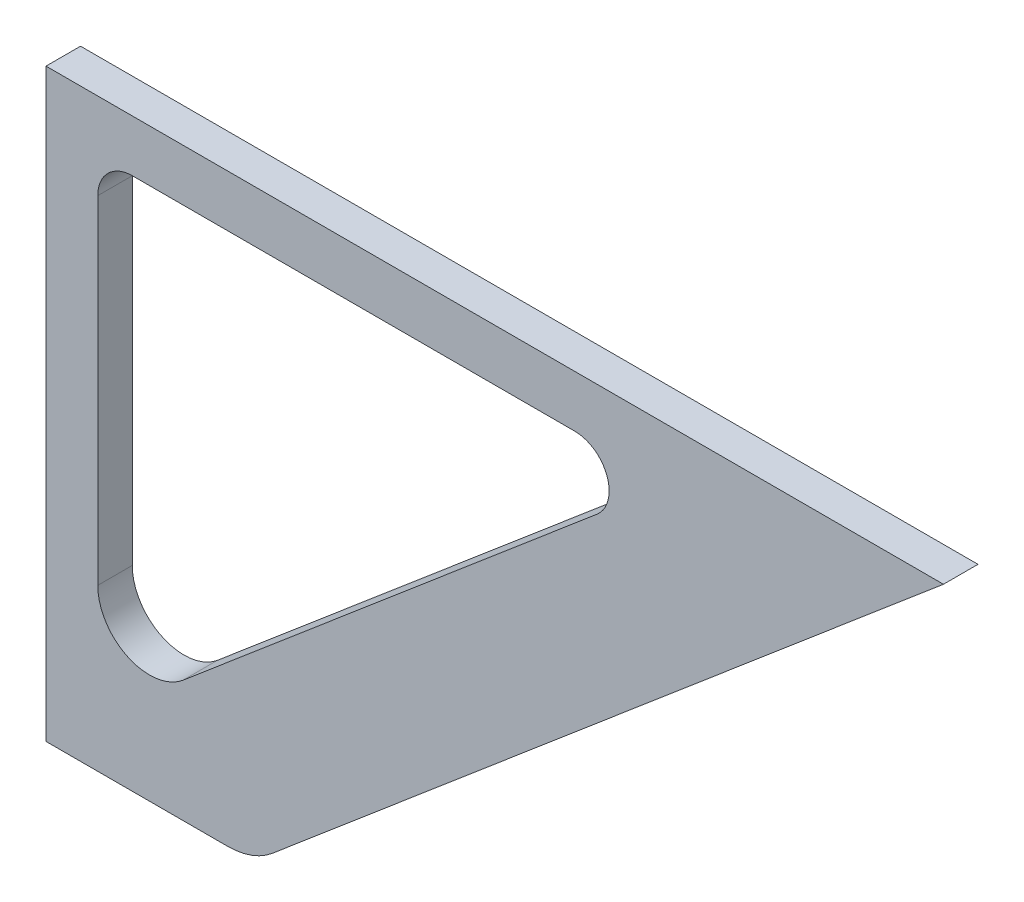
ISO-10303-21;
HEADER;
FILE_DESCRIPTION(('STEP AP214'),'2;1');
FILE_NAME('part.step','',(''),(''),'','','');
FILE_SCHEMA(('AUTOMOTIVE_DESIGN { 1 0 10303 214 1 1 1 1 }'));
ENDSEC;
DATA;
#1=APPLICATION_CONTEXT('core data for automotive mechanical design processes');
#2=APPLICATION_PROTOCOL_DEFINITION('international standard','automotive_design',2000,#1);
#3=PRODUCT_CONTEXT('',#1,'mechanical');
#4=PRODUCT('Part','Part','',(#3));
#5=PRODUCT_RELATED_PRODUCT_CATEGORY('part','',(#4));
#6=PRODUCT_DEFINITION_FORMATION('','',#4);
#7=PRODUCT_DEFINITION_CONTEXT('part definition',#1,'design');
#8=PRODUCT_DEFINITION('design','',#6,#7);
#9=PRODUCT_DEFINITION_SHAPE('','',#8);
#10=(LENGTH_UNIT() NAMED_UNIT(*) SI_UNIT(.MILLI.,.METRE.));
#11=(NAMED_UNIT(*) PLANE_ANGLE_UNIT() SI_UNIT($,.RADIAN.));
#12=(NAMED_UNIT(*) SI_UNIT($,.STERADIAN.) SOLID_ANGLE_UNIT());
#13=UNCERTAINTY_MEASURE_WITH_UNIT(LENGTH_MEASURE(1.E-05),#10,'distance_accuracy_value','');
#14=(GEOMETRIC_REPRESENTATION_CONTEXT(3) GLOBAL_UNCERTAINTY_ASSIGNED_CONTEXT((#13)) GLOBAL_UNIT_ASSIGNED_CONTEXT((#10,
#11,#12)) REPRESENTATION_CONTEXT('',''));
#15=CARTESIAN_POINT('',(0.,0.,0.));
#16=DIRECTION('',(0.,0.,1.));
#17=DIRECTION('',(1.,0.,0.));
#18=AXIS2_PLACEMENT_3D('',#15,#16,#17);
#19=CARTESIAN_POINT('',(16.7217506463538,-47.4472,3.175));
#20=DIRECTION('',(0.,0.,1.));
#21=DIRECTION('',(1.,0.,0.));
#22=AXIS2_PLACEMENT_3D('',#19,#20,#21);
#23=PLANE('',#22);
#24=DIRECTION('',(-1.,0.,0.));
#25=VECTOR('',#24,1.);
#26=CARTESIAN_POINT('',(82.55,0.,3.175));
#27=LINE('',#26,#25);
#28=CARTESIAN_POINT('',(82.55,0.,3.175));
#29=VERTEX_POINT('',#28);
#30=CARTESIAN_POINT('',(0.,0.,3.175));
#31=VERTEX_POINT('',#30);
#32=EDGE_CURVE('E169',#29,#31,#27,.T.);
#33=ORIENTED_EDGE('',*,*,#32,.T.);
#34=DIRECTION('',(0.,-1.,0.));
#35=VECTOR('',#34,1.);
#36=CARTESIAN_POINT('',(0.,0.,3.175));
#37=LINE('',#36,#35);
#38=CARTESIAN_POINT('',(0.,-53.7972,3.175));
#39=VERTEX_POINT('',#38);
#40=EDGE_CURVE('E172',#31,#39,#37,.T.);
#41=ORIENTED_EDGE('',*,*,#40,.T.);
#42=DIRECTION('',(1.,0.,0.));
#43=VECTOR('',#42,1.);
#44=CARTESIAN_POINT('',(0.,-53.7972,3.175));
#45=LINE('',#44,#43);
#46=CARTESIAN_POINT('',(16.7217506463538,-53.7972,3.175));
#47=VERTEX_POINT('',#46);
#48=EDGE_CURVE('E175',#39,#47,#45,.T.);
#49=ORIENTED_EDGE('',*,*,#48,.T.);
#50=CARTESIAN_POINT('',(16.7217506463538,-47.4472,3.175));
#51=DIRECTION('',(0.,0.,1.));
#52=DIRECTION('',(1.,0.,0.));
#53=AXIS2_PLACEMENT_3D('',#50,#51,#52);
#54=CIRCLE('',#53,6.35);
#55=CARTESIAN_POINT('',(20.8264368991166,-52.2922026590684,3.175));
#56=VERTEX_POINT('',#55);
#57=EDGE_CURVE('E177',#47,#56,#54,.T.);
#58=ORIENTED_EDGE('',*,*,#57,.T.);
#59=DIRECTION('',(0.762992544735187,0.646407283899651,0.));
#60=VECTOR('',#59,1.);
#61=CARTESIAN_POINT('',(20.8264368991166,-52.2922026590684,3.175));
#62=LINE('',#61,#60);
#63=EDGE_CURVE('E179',#56,#29,#62,.T.);
#64=ORIENTED_EDGE('',*,*,#63,.T.);
#65=EDGE_LOOP('',(#33,#41,#49,#58,#64));
#66=FACE_BOUND('',#65,.T.);
#67=DIRECTION('',(0.,-1.,0.));
#68=VECTOR('',#67,1.);
#69=CARTESIAN_POINT('',(4.76250000000001,-38.9799246558751,3.175));
#70=LINE('',#69,#68);
#71=CARTESIAN_POINT('',(4.7625,-7.93750000000001,3.175));
#72=VERTEX_POINT('',#71);
#73=CARTESIAN_POINT('',(4.76250000000001,-38.9799246558751,3.175));
#74=VERTEX_POINT('',#73);
#75=EDGE_CURVE('E126',#72,#74,#70,.T.);
#76=ORIENTED_EDGE('',*,*,#75,.F.);
#77=CARTESIAN_POINT('',(7.9375,-7.93750000000001,3.175));
#78=DIRECTION('',(0.,0.,1.));
#79=DIRECTION('',(1.,0.,0.));
#80=AXIS2_PLACEMENT_3D('',#77,#78,#79);
#81=CIRCLE('',#80,3.175);
#82=CARTESIAN_POINT('',(7.9375,-4.76250000000001,3.175));
#83=VERTEX_POINT('',#82);
#84=EDGE_CURVE('E118',#83,#72,#81,.T.);
#85=ORIENTED_EDGE('',*,*,#84,.F.);
#86=DIRECTION('',(-1.,0.,0.));
#87=VECTOR('',#86,1.);
#88=CARTESIAN_POINT('',(7.9375,-4.76250000000001,3.175));
#89=LINE('',#88,#87);
#90=CARTESIAN_POINT('',(48.6220819983207,-4.76250000000001,3.175));
#91=VERTEX_POINT('',#90);
#92=EDGE_CURVE('E147',#91,#83,#89,.T.);
#93=ORIENTED_EDGE('',*,*,#92,.F.);
#94=CARTESIAN_POINT('',(48.6220819983207,-7.93750000000001,3.175));
#95=DIRECTION('',(0.,0.,1.));
#96=DIRECTION('',(-1.,0.,0.));
#97=AXIS2_PLACEMENT_3D('',#94,#95,#96);
#98=CIRCLE('',#97,3.175);
#99=CARTESIAN_POINT('',(50.6744251247021,-10.3600013295342,3.175));
#100=VERTEX_POINT('',#99);
#101=EDGE_CURVE('E145',#100,#91,#98,.T.);
#102=ORIENTED_EDGE('',*,*,#101,.F.);
#103=DIRECTION('',(0.762992544735187,0.646407283899651,0.));
#104=VECTOR('',#103,1.);
#105=CARTESIAN_POINT('',(50.6744251247021,-10.3600013295342,3.175));
#106=LINE('',#105,#104);
#107=CARTESIAN_POINT('',(12.6035146895721,-42.6136766501764,3.175));
#108=VERTEX_POINT('',#107);
#109=EDGE_CURVE('E141',#108,#100,#106,.T.);
#110=ORIENTED_EDGE('',*,*,#109,.F.);
#111=CARTESIAN_POINT('',(9.52500000000001,-38.9799246558751,3.175));
#112=DIRECTION('',(0.,0.,1.));
#113=DIRECTION('',(-1.,0.,0.));
#114=AXIS2_PLACEMENT_3D('',#111,#112,#113);
#115=CIRCLE('',#114,4.7625);
#116=EDGE_CURVE('E139',#74,#108,#115,.T.);
#117=ORIENTED_EDGE('',*,*,#116,.F.);
#118=EDGE_LOOP('',(#76,#85,#93,#102,#110,#117));
#119=FACE_BOUND('',#118,.T.);
#120=ADVANCED_FACE('F35',(#66,#119),#23,.T.);
#121=CARTESIAN_POINT('',(16.7217506463538,-47.4472,0.));
#122=DIRECTION('',(0.,0.,1.));
#123=DIRECTION('',(1.,0.,0.));
#124=AXIS2_PLACEMENT_3D('',#121,#122,#123);
#125=PLANE('',#124);
#126=DIRECTION('',(-1.,0.,0.));
#127=VECTOR('',#126,1.);
#128=CARTESIAN_POINT('',(82.55,0.,0.));
#129=LINE('',#128,#127);
#130=CARTESIAN_POINT('',(82.55,0.,0.));
#131=VERTEX_POINT('',#130);
#132=CARTESIAN_POINT('',(0.,0.,0.));
#133=VERTEX_POINT('',#132);
#134=EDGE_CURVE('E134',#131,#133,#129,.T.);
#135=ORIENTED_EDGE('',*,*,#134,.F.);
#136=DIRECTION('',(0.762992544735187,0.646407283899651,0.));
#137=VECTOR('',#136,1.);
#138=CARTESIAN_POINT('',(20.8264368991166,-52.2922026590684,0.));
#139=LINE('',#138,#137);
#140=CARTESIAN_POINT('',(20.8264368991166,-52.2922026590684,0.));
#141=VERTEX_POINT('',#140);
#142=EDGE_CURVE('E173',#141,#131,#139,.T.);
#143=ORIENTED_EDGE('',*,*,#142,.F.);
#144=CARTESIAN_POINT('',(16.7217506463538,-47.4472,0.));
#145=DIRECTION('',(0.,0.,1.));
#146=DIRECTION('',(1.,0.,0.));
#147=AXIS2_PLACEMENT_3D('',#144,#145,#146);
#148=CIRCLE('',#147,6.35);
#149=CARTESIAN_POINT('',(16.7217506463538,-53.7972,0.));
#150=VERTEX_POINT('',#149);
#151=EDGE_CURVE('E188',#150,#141,#148,.T.);
#152=ORIENTED_EDGE('',*,*,#151,.F.);
#153=DIRECTION('',(1.,0.,0.));
#154=VECTOR('',#153,1.);
#155=CARTESIAN_POINT('',(0.,-53.7972,0.));
#156=LINE('',#155,#154);
#157=CARTESIAN_POINT('',(0.,-53.7972,0.));
#158=VERTEX_POINT('',#157);
#159=EDGE_CURVE('E186',#158,#150,#156,.T.);
#160=ORIENTED_EDGE('',*,*,#159,.F.);
#161=DIRECTION('',(0.,-1.,0.));
#162=VECTOR('',#161,1.);
#163=CARTESIAN_POINT('',(0.,0.,0.));
#164=LINE('',#163,#162);
#165=EDGE_CURVE('E184',#133,#158,#164,.T.);
#166=ORIENTED_EDGE('',*,*,#165,.F.);
#167=EDGE_LOOP('',(#135,#143,#152,#160,#166));
#168=FACE_BOUND('',#167,.T.);
#169=CARTESIAN_POINT('',(7.9375,-7.93750000000001,0.));
#170=DIRECTION('',(0.,0.,1.));
#171=DIRECTION('',(1.,0.,0.));
#172=AXIS2_PLACEMENT_3D('',#169,#170,#171);
#173=CIRCLE('',#172,3.175);
#174=CARTESIAN_POINT('',(7.9375,-4.76250000000001,0.));
#175=VERTEX_POINT('',#174);
#176=CARTESIAN_POINT('',(4.7625,-7.93750000000001,0.));
#177=VERTEX_POINT('',#176);
#178=EDGE_CURVE('E58',#175,#177,#173,.T.);
#179=ORIENTED_EDGE('',*,*,#178,.T.);
#180=DIRECTION('',(0.,-1.,0.));
#181=VECTOR('',#180,1.);
#182=CARTESIAN_POINT('',(4.76250000000001,-38.9799246558751,0.));
#183=LINE('',#182,#181);
#184=CARTESIAN_POINT('',(4.76250000000001,-38.9799246558751,0.));
#185=VERTEX_POINT('',#184);
#186=EDGE_CURVE('E133',#177,#185,#183,.T.);
#187=ORIENTED_EDGE('',*,*,#186,.T.);
#188=CARTESIAN_POINT('',(9.52500000000001,-38.9799246558751,0.));
#189=DIRECTION('',(0.,0.,1.));
#190=DIRECTION('',(-1.,0.,0.));
#191=AXIS2_PLACEMENT_3D('',#188,#189,#190);
#192=CIRCLE('',#191,4.7625);
#193=CARTESIAN_POINT('',(12.6035146895721,-42.6136766501764,0.));
#194=VERTEX_POINT('',#193);
#195=EDGE_CURVE('E151',#185,#194,#192,.T.);
#196=ORIENTED_EDGE('',*,*,#195,.T.);
#197=DIRECTION('',(0.762992544735187,0.646407283899651,0.));
#198=VECTOR('',#197,1.);
#199=CARTESIAN_POINT('',(50.6744251247021,-10.3600013295342,0.));
#200=LINE('',#199,#198);
#201=CARTESIAN_POINT('',(50.6744251247021,-10.3600013295342,0.));
#202=VERTEX_POINT('',#201);
#203=EDGE_CURVE('E154',#194,#202,#200,.T.);
#204=ORIENTED_EDGE('',*,*,#203,.T.);
#205=CARTESIAN_POINT('',(48.6220819983207,-7.93750000000001,0.));
#206=DIRECTION('',(0.,0.,1.));
#207=DIRECTION('',(-1.,0.,0.));
#208=AXIS2_PLACEMENT_3D('',#205,#206,#207);
#209=CIRCLE('',#208,3.175);
#210=CARTESIAN_POINT('',(48.6220819983207,-4.76250000000001,0.));
#211=VERTEX_POINT('',#210);
#212=EDGE_CURVE('E157',#202,#211,#209,.T.);
#213=ORIENTED_EDGE('',*,*,#212,.T.);
#214=DIRECTION('',(-1.,0.,0.));
#215=VECTOR('',#214,1.);
#216=CARTESIAN_POINT('',(7.9375,-4.76250000000001,0.));
#217=LINE('',#216,#215);
#218=EDGE_CURVE('E127',#211,#175,#217,.T.);
#219=ORIENTED_EDGE('',*,*,#218,.T.);
#220=EDGE_LOOP('',(#179,#187,#196,#204,#213,#219));
#221=FACE_BOUND('',#220,.T.);
#222=ADVANCED_FACE('F209',(#168,#221),#125,.F.);
#223=CARTESIAN_POINT('',(82.55,0.,3.175));
#224=DIRECTION('',(0.,-1.,0.));
#225=DIRECTION('',(1.,0.,0.));
#226=AXIS2_PLACEMENT_3D('',#223,#224,#225);
#227=PLANE('',#226);
#228=ORIENTED_EDGE('',*,*,#134,.T.);
#229=DIRECTION('',(0.,0.,-1.));
#230=VECTOR('',#229,1.);
#231=CARTESIAN_POINT('',(0.,0.,3.175));
#232=LINE('',#231,#230);
#233=EDGE_CURVE('E11',#31,#133,#232,.T.);
#234=ORIENTED_EDGE('',*,*,#233,.F.);
#235=ORIENTED_EDGE('',*,*,#32,.F.);
#236=DIRECTION('',(0.,0.,-1.));
#237=VECTOR('',#236,1.);
#238=CARTESIAN_POINT('',(82.55,0.,3.175));
#239=LINE('',#238,#237);
#240=EDGE_CURVE('E181',#29,#131,#239,.T.);
#241=ORIENTED_EDGE('',*,*,#240,.T.);
#242=EDGE_LOOP('',(#228,#234,#235,#241));
#243=FACE_BOUND('',#242,.T.);
#244=ADVANCED_FACE('F37',(#243),#227,.F.);
#245=CARTESIAN_POINT('',(0.,0.,3.175));
#246=DIRECTION('',(1.,0.,0.));
#247=DIRECTION('',(0.,0.,-1.));
#248=AXIS2_PLACEMENT_3D('',#245,#246,#247);
#249=PLANE('',#248);
#250=ORIENTED_EDGE('',*,*,#165,.T.);
#251=DIRECTION('',(0.,0.,-1.));
#252=VECTOR('',#251,1.);
#253=CARTESIAN_POINT('',(0.,-53.7972,3.175));
#254=LINE('',#253,#252);
#255=EDGE_CURVE('E43',#39,#158,#254,.T.);
#256=ORIENTED_EDGE('',*,*,#255,.F.);
#257=ORIENTED_EDGE('',*,*,#40,.F.);
#258=ORIENTED_EDGE('',*,*,#233,.T.);
#259=EDGE_LOOP('',(#250,#256,#257,#258));
#260=FACE_BOUND('',#259,.T.);
#261=ADVANCED_FACE('F223',(#260),#249,.F.);
#262=CARTESIAN_POINT('',(0.,-53.7972,3.175));
#263=DIRECTION('',(0.,1.,0.));
#264=DIRECTION('',(0.,0.,1.));
#265=AXIS2_PLACEMENT_3D('',#262,#263,#264);
#266=PLANE('',#265);
#267=ORIENTED_EDGE('',*,*,#159,.T.);
#268=DIRECTION('',(0.,0.,-1.));
#269=VECTOR('',#268,1.);
#270=CARTESIAN_POINT('',(16.7217506463538,-53.7972,3.175));
#271=LINE('',#270,#269);
#272=EDGE_CURVE('E196',#47,#150,#271,.T.);
#273=ORIENTED_EDGE('',*,*,#272,.F.);
#274=ORIENTED_EDGE('',*,*,#48,.F.);
#275=ORIENTED_EDGE('',*,*,#255,.T.);
#276=EDGE_LOOP('',(#267,#273,#274,#275));
#277=FACE_BOUND('',#276,.T.);
#278=ADVANCED_FACE('F203',(#277),#266,.F.);
#279=CARTESIAN_POINT('',(16.7217506463538,-47.4472,3.175));
#280=DIRECTION('',(0.,0.,-1.));
#281=DIRECTION('',(-1.,0.,0.));
#282=AXIS2_PLACEMENT_3D('',#279,#280,#281);
#283=CYLINDRICAL_SURFACE('',#282,6.35);
#284=ORIENTED_EDGE('',*,*,#151,.T.);
#285=DIRECTION('',(0.,0.,-1.));
#286=VECTOR('',#285,1.);
#287=CARTESIAN_POINT('',(20.8264368991166,-52.2922026590684,3.175));
#288=LINE('',#287,#286);
#289=EDGE_CURVE('E193',#56,#141,#288,.T.);
#290=ORIENTED_EDGE('',*,*,#289,.F.);
#291=ORIENTED_EDGE('',*,*,#57,.F.);
#292=ORIENTED_EDGE('',*,*,#272,.T.);
#293=EDGE_LOOP('',(#284,#290,#291,#292));
#294=FACE_BOUND('',#293,.T.);
#295=ADVANCED_FACE('F214',(#294),#283,.T.);
#296=CARTESIAN_POINT('',(20.8264368991166,-52.2922026590684,3.175));
#297=DIRECTION('',(-0.646407283899651,0.762992544735187,0.));
#298=DIRECTION('',(-0.762992544735187,-0.646407283899651,0.));
#299=AXIS2_PLACEMENT_3D('',#296,#297,#298);
#300=PLANE('',#299);
#301=ORIENTED_EDGE('',*,*,#142,.T.);
#302=ORIENTED_EDGE('',*,*,#240,.F.);
#303=ORIENTED_EDGE('',*,*,#63,.F.);
#304=ORIENTED_EDGE('',*,*,#289,.T.);
#305=EDGE_LOOP('',(#301,#302,#303,#304));
#306=FACE_BOUND('',#305,.T.);
#307=ADVANCED_FACE('F218',(#306),#300,.F.);
#308=CARTESIAN_POINT('',(7.9375,-7.93750000000001,3.175));
#309=DIRECTION('',(0.,0.,-1.));
#310=DIRECTION('',(-1.,0.,0.));
#311=AXIS2_PLACEMENT_3D('',#308,#309,#310);
#312=CYLINDRICAL_SURFACE('',#311,3.175);
#313=ORIENTED_EDGE('',*,*,#178,.F.);
#314=DIRECTION('',(0.,0.,-1.));
#315=VECTOR('',#314,1.);
#316=CARTESIAN_POINT('',(7.9375,-4.76250000000001,3.175));
#317=LINE('',#316,#315);
#318=EDGE_CURVE('E122',#83,#175,#317,.T.);
#319=ORIENTED_EDGE('',*,*,#318,.F.);
#320=ORIENTED_EDGE('',*,*,#84,.T.);
#321=DIRECTION('',(0.,0.,-1.));
#322=VECTOR('',#321,1.);
#323=CARTESIAN_POINT('',(4.7625,-7.93750000000001,3.175));
#324=LINE('',#323,#322);
#325=EDGE_CURVE('E121',#72,#177,#324,.T.);
#326=ORIENTED_EDGE('',*,*,#325,.T.);
#327=EDGE_LOOP('',(#313,#319,#320,#326));
#328=FACE_BOUND('',#327,.T.);
#329=ADVANCED_FACE('F120',(#328),#312,.F.);
#330=CARTESIAN_POINT('',(4.76250000000001,-38.9799246558751,3.175));
#331=DIRECTION('',(1.,0.,0.));
#332=DIRECTION('',(0.,1.,0.));
#333=AXIS2_PLACEMENT_3D('',#330,#331,#332);
#334=PLANE('',#333);
#335=ORIENTED_EDGE('',*,*,#186,.F.);
#336=ORIENTED_EDGE('',*,*,#325,.F.);
#337=ORIENTED_EDGE('',*,*,#75,.T.);
#338=DIRECTION('',(0.,0.,-1.));
#339=VECTOR('',#338,1.);
#340=CARTESIAN_POINT('',(4.76250000000001,-38.9799246558751,3.175));
#341=LINE('',#340,#339);
#342=EDGE_CURVE('E135',#74,#185,#341,.T.);
#343=ORIENTED_EDGE('',*,*,#342,.T.);
#344=EDGE_LOOP('',(#335,#336,#337,#343));
#345=FACE_BOUND('',#344,.T.);
#346=ADVANCED_FACE('F130',(#345),#334,.T.);
#347=CARTESIAN_POINT('',(9.52500000000001,-38.9799246558751,3.175));
#348=DIRECTION('',(0.,0.,-1.));
#349=DIRECTION('',(-1.,0.,0.));
#350=AXIS2_PLACEMENT_3D('',#347,#348,#349);
#351=CYLINDRICAL_SURFACE('',#350,4.7625);
#352=ORIENTED_EDGE('',*,*,#195,.F.);
#353=ORIENTED_EDGE('',*,*,#342,.F.);
#354=ORIENTED_EDGE('',*,*,#116,.T.);
#355=DIRECTION('',(0.,0.,-1.));
#356=VECTOR('',#355,1.);
#357=CARTESIAN_POINT('',(12.6035146895721,-42.6136766501764,3.175));
#358=LINE('',#357,#356);
#359=EDGE_CURVE('E166',#108,#194,#358,.T.);
#360=ORIENTED_EDGE('',*,*,#359,.T.);
#361=EDGE_LOOP('',(#352,#353,#354,#360));
#362=FACE_BOUND('',#361,.T.);
#363=ADVANCED_FACE('F266',(#362),#351,.F.);
#364=CARTESIAN_POINT('',(50.6744251247021,-10.3600013295342,3.175));
#365=DIRECTION('',(-0.646407283899651,0.762992544735187,0.));
#366=DIRECTION('',(-0.762992544735187,-0.646407283899651,0.));
#367=AXIS2_PLACEMENT_3D('',#364,#365,#366);
#368=PLANE('',#367);
#369=ORIENTED_EDGE('',*,*,#203,.F.);
#370=ORIENTED_EDGE('',*,*,#359,.F.);
#371=ORIENTED_EDGE('',*,*,#109,.T.);
#372=DIRECTION('',(0.,0.,-1.));
#373=VECTOR('',#372,1.);
#374=CARTESIAN_POINT('',(50.6744251247021,-10.3600013295342,3.175));
#375=LINE('',#374,#373);
#376=EDGE_CURVE('E164',#100,#202,#375,.T.);
#377=ORIENTED_EDGE('',*,*,#376,.T.);
#378=EDGE_LOOP('',(#369,#370,#371,#377));
#379=FACE_BOUND('',#378,.T.);
#380=ADVANCED_FACE('F272',(#379),#368,.T.);
#381=CARTESIAN_POINT('',(48.6220819983207,-7.93750000000001,3.175));
#382=DIRECTION('',(0.,0.,-1.));
#383=DIRECTION('',(-1.,0.,0.));
#384=AXIS2_PLACEMENT_3D('',#381,#382,#383);
#385=CYLINDRICAL_SURFACE('',#384,3.175);
#386=ORIENTED_EDGE('',*,*,#212,.F.);
#387=ORIENTED_EDGE('',*,*,#376,.F.);
#388=ORIENTED_EDGE('',*,*,#101,.T.);
#389=DIRECTION('',(0.,0.,-1.));
#390=VECTOR('',#389,1.);
#391=CARTESIAN_POINT('',(48.6220819983207,-4.76250000000001,3.175));
#392=LINE('',#391,#390);
#393=EDGE_CURVE('E50',#91,#211,#392,.T.);
#394=ORIENTED_EDGE('',*,*,#393,.T.);
#395=EDGE_LOOP('',(#386,#387,#388,#394));
#396=FACE_BOUND('',#395,.T.);
#397=ADVANCED_FACE('F280',(#396),#385,.F.);
#398=CARTESIAN_POINT('',(7.9375,-4.76250000000001,3.175));
#399=DIRECTION('',(0.,-1.,0.));
#400=DIRECTION('',(1.,0.,0.));
#401=AXIS2_PLACEMENT_3D('',#398,#399,#400);
#402=PLANE('',#401);
#403=ORIENTED_EDGE('',*,*,#218,.F.);
#404=ORIENTED_EDGE('',*,*,#393,.F.);
#405=ORIENTED_EDGE('',*,*,#92,.T.);
#406=ORIENTED_EDGE('',*,*,#318,.T.);
#407=EDGE_LOOP('',(#403,#404,#405,#406));
#408=FACE_BOUND('',#407,.T.);
#409=ADVANCED_FACE('F288',(#408),#402,.T.);
#410=CLOSED_SHELL('',(#120,#222,#244,#261,#278,#295,#307,#329,#346,#363,#380,#397,#409));
#411=MANIFOLD_SOLID_BREP('B2',#410);
#412=ADVANCED_BREP_SHAPE_REPRESENTATION('',(#18,#411),#14);
#413=SHAPE_DEFINITION_REPRESENTATION(#9,#412);
ENDSEC;
END-ISO-10303-21;
